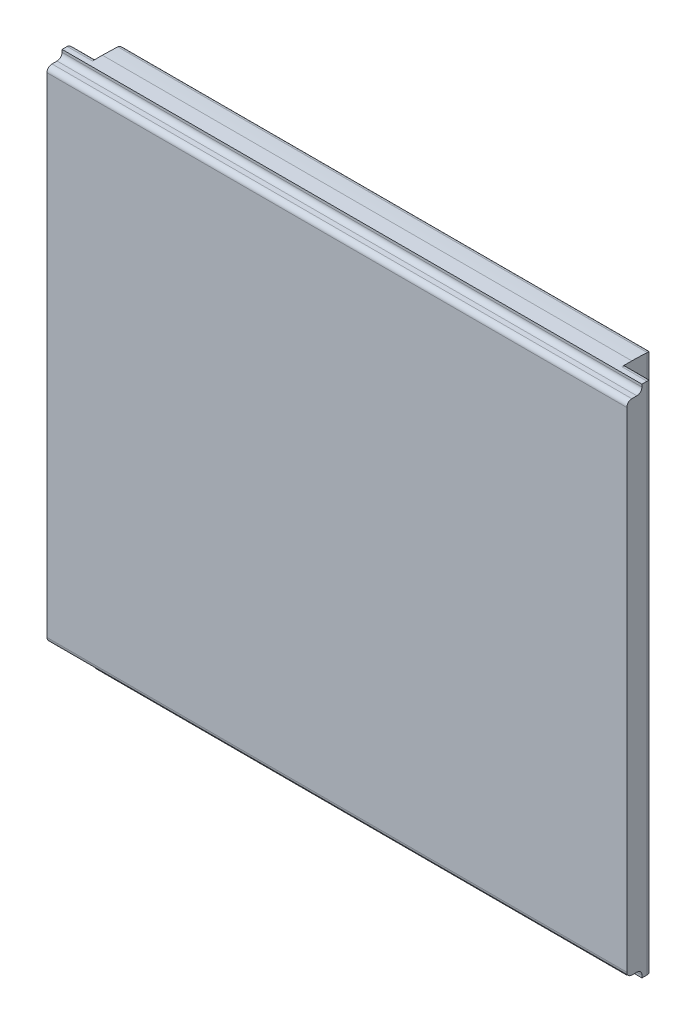
ISO-10303-21;
HEADER;
FILE_DESCRIPTION(('STEP AP214'),'2;1');
FILE_NAME('part.step','',(''),(''),'','','');
FILE_SCHEMA(('AUTOMOTIVE_DESIGN { 1 0 10303 214 1 1 1 1 }'));
ENDSEC;
DATA;
#1=APPLICATION_CONTEXT('core data for automotive mechanical design processes');
#2=APPLICATION_PROTOCOL_DEFINITION('international standard','automotive_design',2000,#1);
#3=PRODUCT_CONTEXT('',#1,'mechanical');
#4=PRODUCT('Part','Part','',(#3));
#5=PRODUCT_RELATED_PRODUCT_CATEGORY('part','',(#4));
#6=PRODUCT_DEFINITION_FORMATION('','',#4);
#7=PRODUCT_DEFINITION_CONTEXT('part definition',#1,'design');
#8=PRODUCT_DEFINITION('design','',#6,#7);
#9=PRODUCT_DEFINITION_SHAPE('','',#8);
#10=(LENGTH_UNIT() NAMED_UNIT(*) SI_UNIT(.MILLI.,.METRE.));
#11=(NAMED_UNIT(*) PLANE_ANGLE_UNIT() SI_UNIT($,.RADIAN.));
#12=(NAMED_UNIT(*) SI_UNIT($,.STERADIAN.) SOLID_ANGLE_UNIT());
#13=UNCERTAINTY_MEASURE_WITH_UNIT(LENGTH_MEASURE(1.E-05),#10,'distance_accuracy_value','');
#14=(GEOMETRIC_REPRESENTATION_CONTEXT(3) GLOBAL_UNCERTAINTY_ASSIGNED_CONTEXT((#13)) GLOBAL_UNIT_ASSIGNED_CONTEXT((#10,
#11,#12)) REPRESENTATION_CONTEXT('',''));
#15=CARTESIAN_POINT('',(0.,0.,0.));
#16=DIRECTION('',(0.,0.,1.));
#17=DIRECTION('',(1.,0.,0.));
#18=AXIS2_PLACEMENT_3D('',#15,#16,#17);
#19=CARTESIAN_POINT('',(52.5,-51.0099999999999,48.));
#20=DIRECTION('',(1.,0.,0.));
#21=DIRECTION('',(0.,0.,-1.));
#22=AXIS2_PLACEMENT_3D('',#19,#20,#21);
#23=PLANE('',#22);
#24=DIRECTION('',(0.,-0.707106781186544,0.707106781186551));
#25=VECTOR('',#24,1.);
#26=CARTESIAN_POINT('',(52.5,-53.2549999999999,45.755));
#27=LINE('',#26,#25);
#28=CARTESIAN_POINT('',(52.5,-51.4999999999999,44.));
#29=VERTEX_POINT('',#28);
#30=CARTESIAN_POINT('',(52.5,-53.8786796564403,46.3786796564404));
#31=VERTEX_POINT('',#30);
#32=EDGE_CURVE('E441',#29,#31,#27,.T.);
#33=ORIENTED_EDGE('',*,*,#32,.F.);
#34=DIRECTION('',(0.,-1.,0.));
#35=VECTOR('',#34,1.);
#36=CARTESIAN_POINT('',(52.5,-51.0099999999999,44.));
#37=LINE('',#36,#35);
#38=CARTESIAN_POINT('',(52.5,50.9117265087781,44.));
#39=VERTEX_POINT('',#38);
#40=EDGE_CURVE('E228',#29,#39,#37,.F.);
#41=ORIENTED_EDGE('',*,*,#40,.T.);
#42=CARTESIAN_POINT('',(52.5,-50.9999999999999,48.5));
#43=DIRECTION('',(1.,0.,0.));
#44=DIRECTION('',(0.,0.,-1.));
#45=AXIS2_PLACEMENT_3D('',#42,#43,#44);
#46=CIRCLE('',#45,102.011028815516);
#47=CARTESIAN_POINT('',(52.5,50.9999999999999,47.000000000001));
#48=VERTEX_POINT('',#47);
#49=EDGE_CURVE('E222',#39,#48,#46,.T.);
#50=ORIENTED_EDGE('',*,*,#49,.T.);
#51=DIRECTION('',(0.,0.,-1.));
#52=VECTOR('',#51,1.);
#53=CARTESIAN_POINT('',(52.5,50.9999999999999,0.));
#54=LINE('',#53,#52);
#55=CARTESIAN_POINT('',(52.5,50.9999999999999,49.));
#56=VERTEX_POINT('',#55);
#57=EDGE_CURVE('E225',#56,#48,#54,.T.);
#58=ORIENTED_EDGE('',*,*,#57,.F.);
#59=CARTESIAN_POINT('',(52.5,49.9999999999999,49.));
#60=DIRECTION('',(1.,0.,0.));
#61=DIRECTION('',(0.,0.,-1.));
#62=AXIS2_PLACEMENT_3D('',#59,#60,#61);
#63=CIRCLE('',#62,1.);
#64=CARTESIAN_POINT('',(52.5,49.9999999999999,48.));
#65=VERTEX_POINT('',#64);
#66=EDGE_CURVE('E50',#56,#65,#63,.F.);
#67=ORIENTED_EDGE('',*,*,#66,.T.);
#68=DIRECTION('',(0.,1.,0.));
#69=VECTOR('',#68,1.);
#70=CARTESIAN_POINT('',(52.5,-51.0099999999999,48.));
#71=LINE('',#70,#69);
#72=CARTESIAN_POINT('',(52.5,-50.9999999999999,48.));
#73=VERTEX_POINT('',#72);
#74=EDGE_CURVE('E296',#73,#65,#71,.T.);
#75=ORIENTED_EDGE('',*,*,#74,.F.);
#76=DIRECTION('',(0.,0.,-1.));
#77=VECTOR('',#76,1.);
#78=CARTESIAN_POINT('',(52.5,-50.9999999999999,48.));
#79=LINE('',#78,#77);
#80=CARTESIAN_POINT('',(52.5,-50.9999999999999,48.5));
#81=VERTEX_POINT('',#80);
#82=EDGE_CURVE('E583',#81,#73,#79,.T.);
#83=ORIENTED_EDGE('',*,*,#82,.F.);
#84=DIRECTION('',(0.,-1.,0.));
#85=VECTOR('',#84,1.);
#86=CARTESIAN_POINT('',(52.5,-51.0099999999999,48.5));
#87=LINE('',#86,#85);
#88=CARTESIAN_POINT('',(52.5,-52.9999999999999,48.5));
#89=VERTEX_POINT('',#88);
#90=EDGE_CURVE('E599',#81,#89,#87,.T.);
#91=ORIENTED_EDGE('',*,*,#90,.T.);
#92=CARTESIAN_POINT('',(52.5,-52.9999999999999,47.2573593128807));
#93=DIRECTION('',(1.,0.,0.));
#94=DIRECTION('',(0.,0.,-1.));
#95=AXIS2_PLACEMENT_3D('',#92,#93,#94);
#96=CIRCLE('',#95,1.24264068711927);
#97=EDGE_CURVE('E595',#89,#31,#96,.T.);
#98=ORIENTED_EDGE('',*,*,#97,.T.);
#99=EDGE_LOOP('',(#33,#41,#50,#58,#67,#75,#83,#91,#98));
#100=FACE_BOUND('',#99,.T.);
#101=ADVANCED_FACE('F40',(#100),#23,.T.);
#102=CARTESIAN_POINT('',(-52.5,-51.0099999999999,48.));
#103=DIRECTION('',(-1.,0.,0.));
#104=DIRECTION('',(0.,0.,1.));
#105=AXIS2_PLACEMENT_3D('',#102,#103,#104);
#106=PLANE('',#105);
#107=CARTESIAN_POINT('',(-52.5,-50.9999999999999,48.5));
#108=DIRECTION('',(-1.,0.,0.));
#109=DIRECTION('',(0.,0.,1.));
#110=AXIS2_PLACEMENT_3D('',#107,#108,#109);
#111=CIRCLE('',#110,102.011028815516);
#112=CARTESIAN_POINT('',(-52.5,50.9999999999999,47.000000000001));
#113=VERTEX_POINT('',#112);
#114=CARTESIAN_POINT('',(-52.5,50.9117265087781,44.));
#115=VERTEX_POINT('',#114);
#116=EDGE_CURVE('E233',#113,#115,#111,.T.);
#117=ORIENTED_EDGE('',*,*,#116,.T.);
#118=DIRECTION('',(0.,1.,0.));
#119=VECTOR('',#118,1.);
#120=CARTESIAN_POINT('',(-52.5,-51.0099999999999,44.));
#121=LINE('',#120,#119);
#122=CARTESIAN_POINT('',(-52.5,-51.4999999999999,44.));
#123=VERTEX_POINT('',#122);
#124=EDGE_CURVE('E66',#115,#123,#121,.F.);
#125=ORIENTED_EDGE('',*,*,#124,.T.);
#126=DIRECTION('',(0.,-0.707106781186544,0.707106781186551));
#127=VECTOR('',#126,1.);
#128=CARTESIAN_POINT('',(-52.5,-53.2549999999999,45.755));
#129=LINE('',#128,#127);
#130=CARTESIAN_POINT('',(-52.5,-53.8786796564403,46.3786796564404));
#131=VERTEX_POINT('',#130);
#132=EDGE_CURVE('E602',#123,#131,#129,.T.);
#133=ORIENTED_EDGE('',*,*,#132,.T.);
#134=CARTESIAN_POINT('',(-52.5,-52.9999999999999,47.2573593128807));
#135=DIRECTION('',(-1.,0.,0.));
#136=DIRECTION('',(0.,0.,1.));
#137=AXIS2_PLACEMENT_3D('',#134,#135,#136);
#138=CIRCLE('',#137,1.24264068711927);
#139=CARTESIAN_POINT('',(-52.5,-52.9999999999999,48.5));
#140=VERTEX_POINT('',#139);
#141=EDGE_CURVE('E449',#140,#131,#138,.F.);
#142=ORIENTED_EDGE('',*,*,#141,.F.);
#143=DIRECTION('',(0.,-1.,0.));
#144=VECTOR('',#143,1.);
#145=CARTESIAN_POINT('',(-52.5,-51.0099999999999,48.5));
#146=LINE('',#145,#144);
#147=CARTESIAN_POINT('',(-52.5,-50.9999999999999,48.5));
#148=VERTEX_POINT('',#147);
#149=EDGE_CURVE('E458',#148,#140,#146,.T.);
#150=ORIENTED_EDGE('',*,*,#149,.F.);
#151=DIRECTION('',(0.,0.,-1.));
#152=VECTOR('',#151,1.);
#153=CARTESIAN_POINT('',(-52.5,-50.9999999999999,48.));
#154=LINE('',#153,#152);
#155=CARTESIAN_POINT('',(-52.5,-50.9999999999999,48.));
#156=VERTEX_POINT('',#155);
#157=EDGE_CURVE('E232',#148,#156,#154,.T.);
#158=ORIENTED_EDGE('',*,*,#157,.T.);
#159=DIRECTION('',(0.,1.,0.));
#160=VECTOR('',#159,1.);
#161=CARTESIAN_POINT('',(-52.5,-51.0099999999999,48.));
#162=LINE('',#161,#160);
#163=CARTESIAN_POINT('',(-52.5,49.9999999999999,48.));
#164=VERTEX_POINT('',#163);
#165=EDGE_CURVE('E300',#156,#164,#162,.T.);
#166=ORIENTED_EDGE('',*,*,#165,.T.);
#167=CARTESIAN_POINT('',(-52.5,49.9999999999999,49.));
#168=DIRECTION('',(-1.,0.,0.));
#169=DIRECTION('',(0.,0.,1.));
#170=AXIS2_PLACEMENT_3D('',#167,#168,#169);
#171=CIRCLE('',#170,1.);
#172=CARTESIAN_POINT('',(-52.5,50.9999999999999,49.));
#173=VERTEX_POINT('',#172);
#174=EDGE_CURVE('E11',#164,#173,#171,.F.);
#175=ORIENTED_EDGE('',*,*,#174,.T.);
#176=DIRECTION('',(0.,0.,1.));
#177=VECTOR('',#176,1.);
#178=CARTESIAN_POINT('',(-52.5,50.9999999999999,0.));
#179=LINE('',#178,#177);
#180=EDGE_CURVE('E250',#113,#173,#179,.T.);
#181=ORIENTED_EDGE('',*,*,#180,.F.);
#182=EDGE_LOOP('',(#117,#125,#133,#142,#150,#158,#166,#175,#181));
#183=FACE_BOUND('',#182,.T.);
#184=ADVANCED_FACE('F610',(#183),#106,.T.);
#185=CARTESIAN_POINT('',(0.,50.9999999999999,0.));
#186=DIRECTION('',(0.,1.,0.));
#187=DIRECTION('',(0.,0.,1.));
#188=AXIS2_PLACEMENT_3D('',#185,#186,#187);
#189=PLANE('',#188);
#190=DIRECTION('',(0.,0.,-1.));
#191=VECTOR('',#190,1.);
#192=CARTESIAN_POINT('',(57.5,50.9999999999999,0.));
#193=LINE('',#192,#191);
#194=CARTESIAN_POINT('',(57.5,50.9999999999999,50.));
#195=VERTEX_POINT('',#194);
#196=CARTESIAN_POINT('',(57.5,50.9999999999999,49.));
#197=VERTEX_POINT('',#196);
#198=EDGE_CURVE('E251',#195,#197,#193,.T.);
#199=ORIENTED_EDGE('',*,*,#198,.T.);
#200=DIRECTION('',(-1.,0.,0.));
#201=VECTOR('',#200,1.);
#202=CARTESIAN_POINT('',(0.,50.9999999999999,49.));
#203=LINE('',#202,#201);
#204=EDGE_CURVE('E248',#197,#56,#203,.T.);
#205=ORIENTED_EDGE('',*,*,#204,.T.);
#206=ORIENTED_EDGE('',*,*,#57,.T.);
#207=DIRECTION('',(-1.,0.,0.));
#208=VECTOR('',#207,1.);
#209=CARTESIAN_POINT('',(57.5,50.9999999999999,47.000000000001));
#210=LINE('',#209,#208);
#211=EDGE_CURVE('E236',#48,#113,#210,.T.);
#212=ORIENTED_EDGE('',*,*,#211,.T.);
#213=ORIENTED_EDGE('',*,*,#180,.T.);
#214=DIRECTION('',(-1.,0.,0.));
#215=VECTOR('',#214,1.);
#216=CARTESIAN_POINT('',(0.,50.9999999999999,49.));
#217=LINE('',#216,#215);
#218=CARTESIAN_POINT('',(-57.5,50.9999999999999,49.));
#219=VERTEX_POINT('',#218);
#220=EDGE_CURVE('E326',#173,#219,#217,.T.);
#221=ORIENTED_EDGE('',*,*,#220,.T.);
#222=DIRECTION('',(0.,0.,1.));
#223=VECTOR('',#222,1.);
#224=CARTESIAN_POINT('',(-57.5,50.9999999999999,0.));
#225=LINE('',#224,#223);
#226=CARTESIAN_POINT('',(-57.5,50.9999999999999,50.));
#227=VERTEX_POINT('',#226);
#228=EDGE_CURVE('E255',#219,#227,#225,.T.);
#229=ORIENTED_EDGE('',*,*,#228,.T.);
#230=DIRECTION('',(-1.,0.,0.));
#231=VECTOR('',#230,1.);
#232=CARTESIAN_POINT('',(62.5,50.9999999999999,50.));
#233=LINE('',#232,#231);
#234=EDGE_CURVE('E301',#195,#227,#233,.T.);
#235=ORIENTED_EDGE('',*,*,#234,.F.);
#236=EDGE_LOOP('',(#199,#205,#206,#212,#213,#221,#229,#235));
#237=FACE_BOUND('',#236,.T.);
#238=ADVANCED_FACE('F246',(#237),#189,.T.);
#239=CARTESIAN_POINT('',(72.5,62.5,43.));
#240=DIRECTION('',(0.,0.,-1.));
#241=DIRECTION('',(-1.,0.,0.));
#242=AXIS2_PLACEMENT_3D('',#239,#240,#241);
#243=PLANE('',#242);
#244=DIRECTION('',(1.,0.,0.));
#245=VECTOR('',#244,1.);
#246=CARTESIAN_POINT('',(-52.5,-50.1339745962155,43.));
#247=LINE('',#246,#245);
#248=CARTESIAN_POINT('',(51.5,-50.1339745962155,43.));
#249=VERTEX_POINT('',#248);
#250=CARTESIAN_POINT('',(-51.5,-50.1339745962155,43.));
#251=VERTEX_POINT('',#250);
#252=EDGE_CURVE('E347',#249,#251,#247,.F.);
#253=ORIENTED_EDGE('',*,*,#252,.T.);
#254=DIRECTION('',(0.,1.,0.));
#255=VECTOR('',#254,1.);
#256=CARTESIAN_POINT('',(-51.5,62.5,43.));
#257=LINE('',#256,#255);
#258=CARTESIAN_POINT('',(-51.5,49.9107424527684,43.));
#259=VERTEX_POINT('',#258);
#260=EDGE_CURVE('E354',#251,#259,#257,.T.);
#261=ORIENTED_EDGE('',*,*,#260,.T.);
#262=DIRECTION('',(-1.,0.,0.));
#263=VECTOR('',#262,1.);
#264=CARTESIAN_POINT('',(72.5,49.9107424527684,43.));
#265=LINE('',#264,#263);
#266=CARTESIAN_POINT('',(51.5,49.9107424527684,43.));
#267=VERTEX_POINT('',#266);
#268=EDGE_CURVE('E350',#259,#267,#265,.F.);
#269=ORIENTED_EDGE('',*,*,#268,.T.);
#270=DIRECTION('',(0.,-1.,0.));
#271=VECTOR('',#270,1.);
#272=CARTESIAN_POINT('',(51.5,62.5,43.));
#273=LINE('',#272,#271);
#274=EDGE_CURVE('E344',#267,#249,#273,.T.);
#275=ORIENTED_EDGE('',*,*,#274,.T.);
#276=EDGE_LOOP('',(#253,#261,#269,#275));
#277=FACE_BOUND('',#276,.T.);
#278=CARTESIAN_POINT('',(-30.,47.4999999999999,43.));
#279=DIRECTION('',(0.,0.,-1.));
#280=DIRECTION('',(-1.,0.,0.));
#281=AXIS2_PLACEMENT_3D('',#278,#279,#280);
#282=CIRCLE('',#281,1.5);
#283=CARTESIAN_POINT('',(-31.5,47.4999999999999,43.));
#284=VERTEX_POINT('',#283);
#285=EDGE_CURVE('E310',#284,#284,#282,.F.);
#286=ORIENTED_EDGE('',*,*,#285,.T.);
#287=EDGE_LOOP('',(#286));
#288=FACE_BOUND('',#287,.T.);
#289=CARTESIAN_POINT('',(0.,38.5,43.));
#290=DIRECTION('',(0.,0.,-1.));
#291=DIRECTION('',(-1.,0.,0.));
#292=AXIS2_PLACEMENT_3D('',#289,#290,#291);
#293=CIRCLE('',#292,2.4);
#294=CARTESIAN_POINT('',(-2.40000000000001,38.5,43.));
#295=VERTEX_POINT('',#294);
#296=EDGE_CURVE('E306',#295,#295,#293,.F.);
#297=ORIENTED_EDGE('',*,*,#296,.T.);
#298=EDGE_LOOP('',(#297));
#299=FACE_BOUND('',#298,.T.);
#300=CARTESIAN_POINT('',(30.,47.4999999999999,43.));
#301=DIRECTION('',(0.,0.,-1.));
#302=DIRECTION('',(-1.,0.,0.));
#303=AXIS2_PLACEMENT_3D('',#300,#301,#302);
#304=CIRCLE('',#303,1.5);
#305=CARTESIAN_POINT('',(28.5,47.4999999999999,43.));
#306=VERTEX_POINT('',#305);
#307=EDGE_CURVE('E302',#306,#306,#304,.F.);
#308=ORIENTED_EDGE('',*,*,#307,.T.);
#309=EDGE_LOOP('',(#308));
#310=FACE_BOUND('',#309,.T.);
#311=ADVANCED_FACE('F676',(#277,#288,#299,#310),#243,.T.);
#312=CARTESIAN_POINT('',(0.,-50.9999999999999,0.));
#313=DIRECTION('',(0.,-1.,0.));
#314=DIRECTION('',(0.,0.,-1.));
#315=AXIS2_PLACEMENT_3D('',#312,#313,#314);
#316=PLANE('',#315);
#317=DIRECTION('',(0.,0.,-1.));
#318=VECTOR('',#317,1.);
#319=CARTESIAN_POINT('',(-57.5,-50.9999999999999,0.));
#320=LINE('',#319,#318);
#321=CARTESIAN_POINT('',(-57.5,-50.9999999999999,50.));
#322=VERTEX_POINT('',#321);
#323=CARTESIAN_POINT('',(-57.5,-50.9999999999999,49.));
#324=VERTEX_POINT('',#323);
#325=EDGE_CURVE('E273',#322,#324,#320,.T.);
#326=ORIENTED_EDGE('',*,*,#325,.T.);
#327=CARTESIAN_POINT('',(-56.5,-50.9999999999999,49.));
#328=DIRECTION('',(0.,-1.,0.));
#329=DIRECTION('',(0.,0.,-1.));
#330=AXIS2_PLACEMENT_3D('',#327,#328,#329);
#331=CIRCLE('',#330,1.);
#332=CARTESIAN_POINT('',(-56.5,-50.9999999999999,48.));
#333=VERTEX_POINT('',#332);
#334=EDGE_CURVE('E395',#324,#333,#331,.T.);
#335=ORIENTED_EDGE('',*,*,#334,.T.);
#336=DIRECTION('',(1.,0.,0.));
#337=VECTOR('',#336,1.);
#338=CARTESIAN_POINT('',(0.,-50.9999999999999,48.));
#339=LINE('',#338,#337);
#340=EDGE_CURVE('E268',#333,#156,#339,.T.);
#341=ORIENTED_EDGE('',*,*,#340,.T.);
#342=ORIENTED_EDGE('',*,*,#157,.F.);
#343=DIRECTION('',(1.,0.,0.));
#344=VECTOR('',#343,1.);
#345=CARTESIAN_POINT('',(-58.4594226755417,-50.9999999999999,48.5));
#346=LINE('',#345,#344);
#347=EDGE_CURVE('E446',#148,#81,#346,.T.);
#348=ORIENTED_EDGE('',*,*,#347,.T.);
#349=ORIENTED_EDGE('',*,*,#82,.T.);
#350=DIRECTION('',(1.,0.,0.));
#351=VECTOR('',#350,1.);
#352=CARTESIAN_POINT('',(0.,-50.9999999999999,48.));
#353=LINE('',#352,#351);
#354=CARTESIAN_POINT('',(56.5,-50.9999999999999,48.));
#355=VERTEX_POINT('',#354);
#356=EDGE_CURVE('E264',#73,#355,#353,.T.);
#357=ORIENTED_EDGE('',*,*,#356,.T.);
#358=CARTESIAN_POINT('',(56.5,-50.9999999999999,49.));
#359=DIRECTION('',(0.,-1.,0.));
#360=DIRECTION('',(0.,0.,-1.));
#361=AXIS2_PLACEMENT_3D('',#358,#359,#360);
#362=CIRCLE('',#361,1.);
#363=CARTESIAN_POINT('',(57.5,-50.9999999999999,49.));
#364=VERTEX_POINT('',#363);
#365=EDGE_CURVE('E392',#355,#364,#362,.T.);
#366=ORIENTED_EDGE('',*,*,#365,.T.);
#367=DIRECTION('',(0.,0.,1.));
#368=VECTOR('',#367,1.);
#369=CARTESIAN_POINT('',(57.5,-50.9999999999999,0.));
#370=LINE('',#369,#368);
#371=CARTESIAN_POINT('',(57.5,-50.9999999999999,50.));
#372=VERTEX_POINT('',#371);
#373=EDGE_CURVE('E261',#364,#372,#370,.T.);
#374=ORIENTED_EDGE('',*,*,#373,.T.);
#375=DIRECTION('',(1.,0.,0.));
#376=VECTOR('',#375,1.);
#377=CARTESIAN_POINT('',(62.5,-50.9999999999999,50.));
#378=LINE('',#377,#376);
#379=EDGE_CURVE('E500',#322,#372,#378,.T.);
#380=ORIENTED_EDGE('',*,*,#379,.F.);
#381=EDGE_LOOP('',(#326,#335,#341,#342,#348,#349,#357,#366,#374,#380));
#382=FACE_BOUND('',#381,.T.);
#383=ADVANCED_FACE('F582',(#382),#316,.T.);
#384=CARTESIAN_POINT('',(57.5,-51.0099999999999,48.));
#385=DIRECTION('',(1.,0.,0.));
#386=DIRECTION('',(0.,0.,-1.));
#387=AXIS2_PLACEMENT_3D('',#384,#385,#386);
#388=PLANE('',#387);
#389=ORIENTED_EDGE('',*,*,#373,.F.);
#390=DIRECTION('',(0.,1.,0.));
#391=VECTOR('',#390,1.);
#392=CARTESIAN_POINT('',(57.5,-51.0099999999999,49.));
#393=LINE('',#392,#391);
#394=EDGE_CURVE('E407',#364,#197,#393,.T.);
#395=ORIENTED_EDGE('',*,*,#394,.T.);
#396=ORIENTED_EDGE('',*,*,#198,.F.);
#397=DIRECTION('',(0.,1.,0.));
#398=VECTOR('',#397,1.);
#399=CARTESIAN_POINT('',(57.5,-130.113473882112,50.));
#400=LINE('',#399,#398);
#401=CARTESIAN_POINT('',(57.5,50.5,50.));
#402=VERTEX_POINT('',#401);
#403=EDGE_CURVE('E292',#402,#195,#400,.T.);
#404=ORIENTED_EDGE('',*,*,#403,.F.);
#405=CARTESIAN_POINT('',(57.5,50.5,51.));
#406=DIRECTION('',(1.,0.,0.));
#407=DIRECTION('',(0.,0.,-1.));
#408=AXIS2_PLACEMENT_3D('',#405,#406,#407);
#409=CIRCLE('',#408,1.);
#410=CARTESIAN_POINT('',(57.5,49.5,51.));
#411=VERTEX_POINT('',#410);
#412=EDGE_CURVE('E462',#402,#411,#409,.F.);
#413=ORIENTED_EDGE('',*,*,#412,.T.);
#414=DIRECTION('',(0.,0.,-1.));
#415=VECTOR('',#414,1.);
#416=CARTESIAN_POINT('',(57.5,49.5,0.));
#417=LINE('',#416,#415);
#418=CARTESIAN_POINT('',(57.5,49.5,52.));
#419=VERTEX_POINT('',#418);
#420=EDGE_CURVE('E287',#419,#411,#417,.T.);
#421=ORIENTED_EDGE('',*,*,#420,.F.);
#422=CARTESIAN_POINT('',(57.5,48.5,52.));
#423=DIRECTION('',(1.,0.,0.));
#424=DIRECTION('',(0.,0.,-1.));
#425=AXIS2_PLACEMENT_3D('',#422,#423,#424);
#426=CIRCLE('',#425,1.);
#427=CARTESIAN_POINT('',(57.5,48.5,53.));
#428=VERTEX_POINT('',#427);
#429=EDGE_CURVE('E282',#428,#419,#426,.F.);
#430=ORIENTED_EDGE('',*,*,#429,.F.);
#431=DIRECTION('',(0.,-1.,0.));
#432=VECTOR('',#431,1.);
#433=CARTESIAN_POINT('',(57.5,62.5,53.));
#434=LINE('',#433,#432);
#435=CARTESIAN_POINT('',(57.5,-48.5,53.));
#436=VERTEX_POINT('',#435);
#437=EDGE_CURVE('E257',#428,#436,#434,.T.);
#438=ORIENTED_EDGE('',*,*,#437,.T.);
#439=CARTESIAN_POINT('',(57.5,-48.5,52.));
#440=DIRECTION('',(1.,0.,0.));
#441=DIRECTION('',(0.,0.,-1.));
#442=AXIS2_PLACEMENT_3D('',#439,#440,#441);
#443=CIRCLE('',#442,1.);
#444=CARTESIAN_POINT('',(57.5,-49.5,52.));
#445=VERTEX_POINT('',#444);
#446=EDGE_CURVE('E269',#445,#436,#443,.F.);
#447=ORIENTED_EDGE('',*,*,#446,.F.);
#448=DIRECTION('',(0.,0.,1.));
#449=VECTOR('',#448,1.);
#450=CARTESIAN_POINT('',(57.5,-49.5,0.));
#451=LINE('',#450,#449);
#452=CARTESIAN_POINT('',(57.5,-49.5,51.));
#453=VERTEX_POINT('',#452);
#454=EDGE_CURVE('E274',#453,#445,#451,.T.);
#455=ORIENTED_EDGE('',*,*,#454,.F.);
#456=CARTESIAN_POINT('',(57.5,-50.5,51.));
#457=DIRECTION('',(1.,0.,0.));
#458=DIRECTION('',(0.,0.,-1.));
#459=AXIS2_PLACEMENT_3D('',#456,#457,#458);
#460=CIRCLE('',#459,1.);
#461=CARTESIAN_POINT('',(57.5,-50.5,50.));
#462=VERTEX_POINT('',#461);
#463=EDGE_CURVE('E467',#453,#462,#460,.F.);
#464=ORIENTED_EDGE('',*,*,#463,.T.);
#465=DIRECTION('',(0.,1.,0.));
#466=VECTOR('',#465,1.);
#467=CARTESIAN_POINT('',(57.5,130.113473882112,50.));
#468=LINE('',#467,#466);
#469=EDGE_CURVE('E278',#372,#462,#468,.T.);
#470=ORIENTED_EDGE('',*,*,#469,.F.);
#471=EDGE_LOOP('',(#389,#395,#396,#404,#413,#421,#430,#438,#447,#455,#464,#470));
#472=FACE_BOUND('',#471,.T.);
#473=ADVANCED_FACE('F545',(#472),#388,.T.);
#474=CARTESIAN_POINT('',(57.5,-51.0099999999999,48.));
#475=DIRECTION('',(0.,0.,-1.));
#476=DIRECTION('',(-1.,0.,0.));
#477=AXIS2_PLACEMENT_3D('',#474,#475,#476);
#478=PLANE('',#477);
#479=ORIENTED_EDGE('',*,*,#74,.T.);
#480=DIRECTION('',(-1.,0.,0.));
#481=VECTOR('',#480,1.);
#482=CARTESIAN_POINT('',(57.5,49.9999999999999,48.));
#483=LINE('',#482,#481);
#484=CARTESIAN_POINT('',(56.5,49.9999999999999,48.));
#485=VERTEX_POINT('',#484);
#486=EDGE_CURVE('E335',#65,#485,#483,.F.);
#487=ORIENTED_EDGE('',*,*,#486,.T.);
#488=DIRECTION('',(0.,1.,0.));
#489=VECTOR('',#488,1.);
#490=CARTESIAN_POINT('',(56.5,-51.0099999999999,48.));
#491=LINE('',#490,#489);
#492=EDGE_CURVE('E332',#485,#355,#491,.F.);
#493=ORIENTED_EDGE('',*,*,#492,.T.);
#494=ORIENTED_EDGE('',*,*,#356,.F.);
#495=EDGE_LOOP('',(#479,#487,#493,#494));
#496=FACE_BOUND('',#495,.T.);
#497=ADVANCED_FACE('F581',(#496),#478,.T.);
#498=CARTESIAN_POINT('',(-57.5,-51.0099999999999,48.));
#499=DIRECTION('',(-1.,0.,0.));
#500=DIRECTION('',(0.,0.,1.));
#501=AXIS2_PLACEMENT_3D('',#498,#499,#500);
#502=PLANE('',#501);
#503=ORIENTED_EDGE('',*,*,#228,.F.);
#504=DIRECTION('',(0.,1.,0.));
#505=VECTOR('',#504,1.);
#506=CARTESIAN_POINT('',(-57.5,-51.0099999999999,49.));
#507=LINE('',#506,#505);
#508=EDGE_CURVE('E389',#219,#324,#507,.F.);
#509=ORIENTED_EDGE('',*,*,#508,.T.);
#510=ORIENTED_EDGE('',*,*,#325,.F.);
#511=DIRECTION('',(0.,-1.,0.));
#512=VECTOR('',#511,1.);
#513=CARTESIAN_POINT('',(-57.5,130.113473882112,50.));
#514=LINE('',#513,#512);
#515=CARTESIAN_POINT('',(-57.5,-50.5,50.));
#516=VERTEX_POINT('',#515);
#517=EDGE_CURVE('E281',#516,#322,#514,.T.);
#518=ORIENTED_EDGE('',*,*,#517,.F.);
#519=CARTESIAN_POINT('',(-57.5,-50.5,51.));
#520=DIRECTION('',(-1.,0.,0.));
#521=DIRECTION('',(0.,0.,1.));
#522=AXIS2_PLACEMENT_3D('',#519,#520,#521);
#523=CIRCLE('',#522,1.);
#524=CARTESIAN_POINT('',(-57.5,-49.5,51.));
#525=VERTEX_POINT('',#524);
#526=EDGE_CURVE('E463',#516,#525,#523,.F.);
#527=ORIENTED_EDGE('',*,*,#526,.T.);
#528=DIRECTION('',(0.,0.,-1.));
#529=VECTOR('',#528,1.);
#530=CARTESIAN_POINT('',(-57.5,-49.5,0.));
#531=LINE('',#530,#529);
#532=CARTESIAN_POINT('',(-57.5,-49.5,52.));
#533=VERTEX_POINT('',#532);
#534=EDGE_CURVE('E277',#533,#525,#531,.T.);
#535=ORIENTED_EDGE('',*,*,#534,.F.);
#536=CARTESIAN_POINT('',(-57.5,-48.5,52.));
#537=DIRECTION('',(-1.,0.,0.));
#538=DIRECTION('',(0.,0.,1.));
#539=AXIS2_PLACEMENT_3D('',#536,#537,#538);
#540=CIRCLE('',#539,1.);
#541=CARTESIAN_POINT('',(-57.5,-48.5,53.));
#542=VERTEX_POINT('',#541);
#543=EDGE_CURVE('E272',#542,#533,#540,.F.);
#544=ORIENTED_EDGE('',*,*,#543,.F.);
#545=DIRECTION('',(0.,1.,0.));
#546=VECTOR('',#545,1.);
#547=CARTESIAN_POINT('',(-57.5,62.5,53.));
#548=LINE('',#547,#546);
#549=CARTESIAN_POINT('',(-57.5,48.5,53.));
#550=VERTEX_POINT('',#549);
#551=EDGE_CURVE('E468',#542,#550,#548,.T.);
#552=ORIENTED_EDGE('',*,*,#551,.T.);
#553=CARTESIAN_POINT('',(-57.5,48.5,52.));
#554=DIRECTION('',(-1.,0.,0.));
#555=DIRECTION('',(0.,0.,1.));
#556=AXIS2_PLACEMENT_3D('',#553,#554,#555);
#557=CIRCLE('',#556,1.);
#558=CARTESIAN_POINT('',(-57.5,49.5,52.));
#559=VERTEX_POINT('',#558);
#560=EDGE_CURVE('E286',#559,#550,#557,.F.);
#561=ORIENTED_EDGE('',*,*,#560,.F.);
#562=DIRECTION('',(0.,0.,1.));
#563=VECTOR('',#562,1.);
#564=CARTESIAN_POINT('',(-57.5,49.5,0.));
#565=LINE('',#564,#563);
#566=CARTESIAN_POINT('',(-57.5,49.5,51.));
#567=VERTEX_POINT('',#566);
#568=EDGE_CURVE('E291',#567,#559,#565,.T.);
#569=ORIENTED_EDGE('',*,*,#568,.F.);
#570=CARTESIAN_POINT('',(-57.5,50.5,51.));
#571=DIRECTION('',(-1.,0.,0.));
#572=DIRECTION('',(0.,0.,1.));
#573=AXIS2_PLACEMENT_3D('',#570,#571,#572);
#574=CIRCLE('',#573,1.);
#575=CARTESIAN_POINT('',(-57.5,50.5,50.));
#576=VERTEX_POINT('',#575);
#577=EDGE_CURVE('E457',#567,#576,#574,.F.);
#578=ORIENTED_EDGE('',*,*,#577,.T.);
#579=DIRECTION('',(0.,-1.,0.));
#580=VECTOR('',#579,1.);
#581=CARTESIAN_POINT('',(-57.5,-130.113473882112,50.));
#582=LINE('',#581,#580);
#583=EDGE_CURVE('E295',#227,#576,#582,.T.);
#584=ORIENTED_EDGE('',*,*,#583,.F.);
#585=EDGE_LOOP('',(#503,#509,#510,#518,#527,#535,#544,#552,#561,#569,#578,#584));
#586=FACE_BOUND('',#585,.T.);
#587=ADVANCED_FACE('F638',(#586),#502,.T.);
#588=CARTESIAN_POINT('',(-57.5,-51.0099999999999,48.));
#589=DIRECTION('',(0.,0.,-1.));
#590=DIRECTION('',(-1.,0.,0.));
#591=AXIS2_PLACEMENT_3D('',#588,#589,#590);
#592=PLANE('',#591);
#593=DIRECTION('',(0.,1.,0.));
#594=VECTOR('',#593,1.);
#595=CARTESIAN_POINT('',(-56.5,-51.0099999999999,48.));
#596=LINE('',#595,#594);
#597=CARTESIAN_POINT('',(-56.5,49.9999999999999,48.));
#598=VERTEX_POINT('',#597);
#599=EDGE_CURVE('E338',#333,#598,#596,.T.);
#600=ORIENTED_EDGE('',*,*,#599,.T.);
#601=DIRECTION('',(-1.,0.,0.));
#602=VECTOR('',#601,1.);
#603=CARTESIAN_POINT('',(-57.5,49.9999999999999,48.));
#604=LINE('',#603,#602);
#605=EDGE_CURVE('E341',#598,#164,#604,.F.);
#606=ORIENTED_EDGE('',*,*,#605,.T.);
#607=ORIENTED_EDGE('',*,*,#165,.F.);
#608=ORIENTED_EDGE('',*,*,#340,.F.);
#609=EDGE_LOOP('',(#600,#606,#607,#608));
#610=FACE_BOUND('',#609,.T.);
#611=ADVANCED_FACE('F625',(#610),#592,.T.);
#612=CARTESIAN_POINT('',(72.5,62.5,53.));
#613=DIRECTION('',(0.,0.,-1.));
#614=DIRECTION('',(-1.,0.,0.));
#615=AXIS2_PLACEMENT_3D('',#612,#613,#614);
#616=PLANE('',#615);
#617=ORIENTED_EDGE('',*,*,#437,.F.);
#618=DIRECTION('',(-1.,0.,0.));
#619=VECTOR('',#618,1.);
#620=CARTESIAN_POINT('',(-62.5,48.5,53.));
#621=LINE('',#620,#619);
#622=EDGE_CURVE('E504',#428,#550,#621,.T.);
#623=ORIENTED_EDGE('',*,*,#622,.T.);
#624=ORIENTED_EDGE('',*,*,#551,.F.);
#625=DIRECTION('',(-1.,0.,0.));
#626=VECTOR('',#625,1.);
#627=CARTESIAN_POINT('',(-62.5,-48.5,53.));
#628=LINE('',#627,#626);
#629=EDGE_CURVE('E519',#436,#542,#628,.T.);
#630=ORIENTED_EDGE('',*,*,#629,.F.);
#631=EDGE_LOOP('',(#617,#623,#624,#630));
#632=FACE_BOUND('',#631,.T.);
#633=ADVANCED_FACE('F550',(#632),#616,.F.);
#634=CARTESIAN_POINT('',(72.5,-48.5,52.));
#635=DIRECTION('',(1.,0.,0.));
#636=DIRECTION('',(0.,0.,-1.));
#637=AXIS2_PLACEMENT_3D('',#634,#635,#636);
#638=CYLINDRICAL_SURFACE('',#637,1.);
#639=DIRECTION('',(-1.,0.,0.));
#640=VECTOR('',#639,1.);
#641=CARTESIAN_POINT('',(62.5,-49.5,52.));
#642=LINE('',#641,#640);
#643=EDGE_CURVE('E493',#533,#445,#642,.F.);
#644=ORIENTED_EDGE('',*,*,#643,.T.);
#645=ORIENTED_EDGE('',*,*,#446,.T.);
#646=ORIENTED_EDGE('',*,*,#629,.T.);
#647=ORIENTED_EDGE('',*,*,#543,.T.);
#648=EDGE_LOOP('',(#644,#645,#646,#647));
#649=FACE_BOUND('',#648,.T.);
#650=ADVANCED_FACE('F552',(#649),#638,.T.);
#651=CARTESIAN_POINT('',(0.,-49.5,0.));
#652=DIRECTION('',(0.,-1.,0.));
#653=DIRECTION('',(0.,0.,1.));
#654=AXIS2_PLACEMENT_3D('',#651,#652,#653);
#655=PLANE('',#654);
#656=DIRECTION('',(-1.,0.,0.));
#657=VECTOR('',#656,1.);
#658=CARTESIAN_POINT('',(-62.5,-49.5,51.));
#659=LINE('',#658,#657);
#660=EDGE_CURVE('E527',#453,#525,#659,.T.);
#661=ORIENTED_EDGE('',*,*,#660,.F.);
#662=ORIENTED_EDGE('',*,*,#454,.T.);
#663=ORIENTED_EDGE('',*,*,#643,.F.);
#664=ORIENTED_EDGE('',*,*,#534,.T.);
#665=EDGE_LOOP('',(#661,#662,#663,#664));
#666=FACE_BOUND('',#665,.T.);
#667=ADVANCED_FACE('F555',(#666),#655,.T.);
#668=CARTESIAN_POINT('',(0.,-50.5,51.));
#669=DIRECTION('',(1.,0.,0.));
#670=DIRECTION('',(0.,0.,-1.));
#671=AXIS2_PLACEMENT_3D('',#668,#669,#670);
#672=CYLINDRICAL_SURFACE('',#671,1.);
#673=ORIENTED_EDGE('',*,*,#463,.F.);
#674=ORIENTED_EDGE('',*,*,#660,.T.);
#675=ORIENTED_EDGE('',*,*,#526,.F.);
#676=DIRECTION('',(-1.,0.,0.));
#677=VECTOR('',#676,1.);
#678=CARTESIAN_POINT('',(62.5,-50.5,50.));
#679=LINE('',#678,#677);
#680=EDGE_CURVE('E523',#516,#462,#679,.F.);
#681=ORIENTED_EDGE('',*,*,#680,.T.);
#682=EDGE_LOOP('',(#673,#674,#675,#681));
#683=FACE_BOUND('',#682,.T.);
#684=ADVANCED_FACE('F559',(#683),#672,.F.);
#685=CARTESIAN_POINT('',(62.5,130.113473882112,50.));
#686=DIRECTION('',(0.,0.,1.));
#687=DIRECTION('',(1.,0.,0.));
#688=AXIS2_PLACEMENT_3D('',#685,#686,#687);
#689=PLANE('',#688);
#690=ORIENTED_EDGE('',*,*,#379,.T.);
#691=ORIENTED_EDGE('',*,*,#469,.T.);
#692=ORIENTED_EDGE('',*,*,#680,.F.);
#693=ORIENTED_EDGE('',*,*,#517,.T.);
#694=EDGE_LOOP('',(#690,#691,#692,#693));
#695=FACE_BOUND('',#694,.T.);
#696=ADVANCED_FACE('F563',(#695),#689,.T.);
#697=CARTESIAN_POINT('',(72.5,48.5,52.));
#698=DIRECTION('',(1.,0.,0.));
#699=DIRECTION('',(0.,0.,-1.));
#700=AXIS2_PLACEMENT_3D('',#697,#698,#699);
#701=CYLINDRICAL_SURFACE('',#700,1.);
#702=ORIENTED_EDGE('',*,*,#622,.F.);
#703=ORIENTED_EDGE('',*,*,#429,.T.);
#704=DIRECTION('',(-1.,0.,0.));
#705=VECTOR('',#704,1.);
#706=CARTESIAN_POINT('',(62.5,49.5,52.));
#707=LINE('',#706,#705);
#708=EDGE_CURVE('E515',#559,#419,#707,.F.);
#709=ORIENTED_EDGE('',*,*,#708,.F.);
#710=ORIENTED_EDGE('',*,*,#560,.T.);
#711=EDGE_LOOP('',(#702,#703,#709,#710));
#712=FACE_BOUND('',#711,.T.);
#713=ADVANCED_FACE('F651',(#712),#701,.T.);
#714=CARTESIAN_POINT('',(0.,49.5,0.));
#715=DIRECTION('',(0.,1.,0.));
#716=DIRECTION('',(0.,0.,1.));
#717=AXIS2_PLACEMENT_3D('',#714,#715,#716);
#718=PLANE('',#717);
#719=ORIENTED_EDGE('',*,*,#708,.T.);
#720=ORIENTED_EDGE('',*,*,#420,.T.);
#721=DIRECTION('',(-1.,0.,0.));
#722=VECTOR('',#721,1.);
#723=CARTESIAN_POINT('',(-62.5,49.5,51.));
#724=LINE('',#723,#722);
#725=EDGE_CURVE('E512',#411,#567,#724,.T.);
#726=ORIENTED_EDGE('',*,*,#725,.T.);
#727=ORIENTED_EDGE('',*,*,#568,.T.);
#728=EDGE_LOOP('',(#719,#720,#726,#727));
#729=FACE_BOUND('',#728,.T.);
#730=ADVANCED_FACE('F648',(#729),#718,.T.);
#731=CARTESIAN_POINT('',(0.,50.5,51.));
#732=DIRECTION('',(1.,0.,0.));
#733=DIRECTION('',(0.,0.,-1.));
#734=AXIS2_PLACEMENT_3D('',#731,#732,#733);
#735=CYLINDRICAL_SURFACE('',#734,1.);
#736=ORIENTED_EDGE('',*,*,#412,.F.);
#737=DIRECTION('',(-1.,0.,0.));
#738=VECTOR('',#737,1.);
#739=CARTESIAN_POINT('',(62.5,50.5,50.));
#740=LINE('',#739,#738);
#741=EDGE_CURVE('E508',#576,#402,#740,.F.);
#742=ORIENTED_EDGE('',*,*,#741,.F.);
#743=ORIENTED_EDGE('',*,*,#577,.F.);
#744=ORIENTED_EDGE('',*,*,#725,.F.);
#745=EDGE_LOOP('',(#736,#742,#743,#744));
#746=FACE_BOUND('',#745,.T.);
#747=ADVANCED_FACE('F646',(#746),#735,.F.);
#748=CARTESIAN_POINT('',(62.5,-130.113473882112,50.));
#749=DIRECTION('',(0.,0.,1.));
#750=DIRECTION('',(1.,0.,0.));
#751=AXIS2_PLACEMENT_3D('',#748,#749,#750);
#752=PLANE('',#751);
#753=ORIENTED_EDGE('',*,*,#741,.T.);
#754=ORIENTED_EDGE('',*,*,#403,.T.);
#755=ORIENTED_EDGE('',*,*,#234,.T.);
#756=ORIENTED_EDGE('',*,*,#583,.T.);
#757=EDGE_LOOP('',(#753,#754,#755,#756));
#758=FACE_BOUND('',#757,.T.);
#759=ADVANCED_FACE('F643',(#758),#752,.T.);
#760=CARTESIAN_POINT('',(-58.4594226755417,-52.9999999999999,47.2573593128807));
#761=DIRECTION('',(1.,0.,0.));
#762=DIRECTION('',(0.,0.,-1.));
#763=AXIS2_PLACEMENT_3D('',#760,#761,#762);
#764=CYLINDRICAL_SURFACE('',#763,1.24264068711927);
#765=DIRECTION('',(1.,0.,0.));
#766=VECTOR('',#765,1.);
#767=CARTESIAN_POINT('',(-58.4594226755417,-52.9999999999999,48.5));
#768=LINE('',#767,#766);
#769=EDGE_CURVE('E454',#140,#89,#768,.T.);
#770=ORIENTED_EDGE('',*,*,#769,.F.);
#771=ORIENTED_EDGE('',*,*,#141,.T.);
#772=DIRECTION('',(1.,0.,0.));
#773=VECTOR('',#772,1.);
#774=CARTESIAN_POINT('',(-58.4594226755417,-53.8786796564403,46.3786796564404));
#775=LINE('',#774,#773);
#776=EDGE_CURVE('E442',#131,#31,#775,.T.);
#777=ORIENTED_EDGE('',*,*,#776,.T.);
#778=ORIENTED_EDGE('',*,*,#97,.F.);
#779=EDGE_LOOP('',(#770,#771,#777,#778));
#780=FACE_BOUND('',#779,.T.);
#781=ADVANCED_FACE('F616',(#780),#764,.T.);
#782=CARTESIAN_POINT('',(-58.4594226755417,-53.2549999999999,45.755));
#783=DIRECTION('',(0.,0.707106781186551,0.707106781186544));
#784=DIRECTION('',(0.,-0.707106781186544,0.707106781186551));
#785=AXIS2_PLACEMENT_3D('',#782,#783,#784);
#786=PLANE('',#785);
#787=ORIENTED_EDGE('',*,*,#132,.F.);
#788=CARTESIAN_POINT('',(-51.5,-51.4999999999999,44.));
#789=DIRECTION('',(0.,0.707106781186551,0.707106781186544));
#790=DIRECTION('',(0.,0.707106781186544,-0.707106781186551));
#791=AXIS2_PLACEMENT_3D('',#788,#789,#790);
#792=ELLIPSE('',#791,1.41421356237309,1.);
#793=CARTESIAN_POINT('',(-52.3660254037844,-50.9999999999999,43.5));
#794=VERTEX_POINT('',#793);
#795=EDGE_CURVE('E402',#123,#794,#792,.F.);
#796=ORIENTED_EDGE('',*,*,#795,.T.);
#797=DIRECTION('',(1.,0.,0.));
#798=VECTOR('',#797,1.);
#799=CARTESIAN_POINT('',(-58.4594226755417,-50.9999999999999,43.5));
#800=LINE('',#799,#798);
#801=CARTESIAN_POINT('',(52.3660254037844,-50.9999999999999,43.5));
#802=VERTEX_POINT('',#801);
#803=EDGE_CURVE('E439',#794,#802,#800,.T.);
#804=ORIENTED_EDGE('',*,*,#803,.T.);
#805=CARTESIAN_POINT('',(51.5,-51.4999999999999,44.));
#806=DIRECTION('',(0.,0.707106781186551,0.707106781186544));
#807=DIRECTION('',(0.,-0.707106781186544,0.707106781186551));
#808=AXIS2_PLACEMENT_3D('',#805,#806,#807);
#809=ELLIPSE('',#808,1.41421356237309,1.);
#810=EDGE_CURVE('E58',#802,#29,#809,.F.);
#811=ORIENTED_EDGE('',*,*,#810,.T.);
#812=ORIENTED_EDGE('',*,*,#32,.T.);
#813=ORIENTED_EDGE('',*,*,#776,.F.);
#814=EDGE_LOOP('',(#787,#796,#804,#811,#812,#813));
#815=FACE_BOUND('',#814,.T.);
#816=ADVANCED_FACE('F612',(#815),#786,.F.);
#817=CARTESIAN_POINT('',(-58.4594226755417,-51.0099999999999,48.5));
#818=DIRECTION('',(0.,0.,1.));
#819=DIRECTION('',(1.,0.,0.));
#820=AXIS2_PLACEMENT_3D('',#817,#818,#819);
#821=PLANE('',#820);
#822=ORIENTED_EDGE('',*,*,#347,.F.);
#823=ORIENTED_EDGE('',*,*,#149,.T.);
#824=ORIENTED_EDGE('',*,*,#769,.T.);
#825=ORIENTED_EDGE('',*,*,#90,.F.);
#826=EDGE_LOOP('',(#822,#823,#824,#825));
#827=FACE_BOUND('',#826,.T.);
#828=ADVANCED_FACE('F618',(#827),#821,.T.);
#829=CARTESIAN_POINT('',(57.5,-50.9999999999999,48.5));
#830=DIRECTION('',(-1.,0.,0.));
#831=DIRECTION('',(0.,0.,1.));
#832=AXIS2_PLACEMENT_3D('',#829,#830,#831);
#833=CYLINDRICAL_SURFACE('',#832,102.011028815516);
#834=DIRECTION('',(-1.,0.,0.));
#835=VECTOR('',#834,1.);
#836=CARTESIAN_POINT('',(57.5,50.9097496268966,43.9554504092002));
#837=LINE('',#836,#835);
#838=CARTESIAN_POINT('',(52.4990071741282,50.9097496268966,43.9554504092002));
#839=VERTEX_POINT('',#838);
#840=CARTESIAN_POINT('',(-52.4990071741282,50.9097496268966,43.9554504092002));
#841=VERTEX_POINT('',#840);
#842=EDGE_CURVE('E366',#839,#841,#837,.T.);
#843=ORIENTED_EDGE('',*,*,#842,.T.);
#844=CARTESIAN_POINT('',(-52.4990071741282,50.9097496268966,43.9554504092002));
#845=CARTESIAN_POINT('',(-52.4993380941021,50.9100805667933,43.9628715890585));
#846=CARTESIAN_POINT('',(-52.4995862895784,50.9104107768985,43.9702946448876));
#847=CARTESIAN_POINT('',(-52.4999172315357,50.9110697375256,43.9851445084875));
#848=CARTESIAN_POINT('',(-52.4999999780167,50.9113984880476,43.9925713162583));
#849=CARTESIAN_POINT('',(-52.5,50.9117265087781,44.));
#850=B_SPLINE_CURVE_WITH_KNOTS('',3,(#844,#845,#846,#847,#848,#849),.UNSPECIFIED.,.F.,.F.,(4,2,
4),(0.,0.022303622529838,0.0446072450596756),.UNSPECIFIED.);
#851=EDGE_CURVE('E382',#841,#115,#850,.T.);
#852=ORIENTED_EDGE('',*,*,#851,.T.);
#853=ORIENTED_EDGE('',*,*,#116,.F.);
#854=ORIENTED_EDGE('',*,*,#211,.F.);
#855=ORIENTED_EDGE('',*,*,#49,.F.);
#856=CARTESIAN_POINT('',(52.5,50.9117265087781,44.));
#857=CARTESIAN_POINT('',(52.4999999780167,50.9113984880476,43.9925713162583));
#858=CARTESIAN_POINT('',(52.4999172315357,50.9110697375256,43.9851445084875));
#859=CARTESIAN_POINT('',(52.4995862895785,50.9104107768985,43.9702946448876));
#860=CARTESIAN_POINT('',(52.4993380941021,50.9100805667933,43.9628715890585));
#861=CARTESIAN_POINT('',(52.4990071741282,50.9097496268966,43.9554504092002));
#862=B_SPLINE_CURVE_WITH_KNOTS('',3,(#856,#857,#858,#859,#860,#861),.UNSPECIFIED.,.F.,.F.,(4,2,
4),(0.,0.022303622529836,0.0446072450596741),.UNSPECIFIED.);
#863=EDGE_CURVE('E357',#39,#839,#862,.T.);
#864=ORIENTED_EDGE('',*,*,#863,.T.);
#865=EDGE_LOOP('',(#843,#852,#853,#854,#855,#864));
#866=FACE_BOUND('',#865,.T.);
#867=ADVANCED_FACE('F238',(#866),#833,.T.);
#868=CARTESIAN_POINT('',(0.,38.5,48.));
#869=DIRECTION('',(0.,0.,1.));
#870=DIRECTION('',(1.,0.,0.));
#871=AXIS2_PLACEMENT_3D('',#868,#869,#870);
#872=PLANE('',#871);
#873=CARTESIAN_POINT('',(0.,38.5,48.));
#874=DIRECTION('',(0.,0.,-1.));
#875=DIRECTION('',(-1.,0.,0.));
#876=AXIS2_PLACEMENT_3D('',#873,#874,#875);
#877=CIRCLE('',#876,1.9);
#878=CARTESIAN_POINT('',(-1.90000000000001,38.5,48.));
#879=VERTEX_POINT('',#878);
#880=EDGE_CURVE('E242',#879,#879,#877,.T.);
#881=ORIENTED_EDGE('',*,*,#880,.T.);
#882=EDGE_LOOP('',(#881));
#883=FACE_BOUND('',#882,.T.);
#884=ADVANCED_FACE('F820',(#883),#872,.F.);
#885=CARTESIAN_POINT('',(0.,38.5,43.));
#886=DIRECTION('',(0.,0.,-1.));
#887=DIRECTION('',(-1.,0.,0.));
#888=AXIS2_PLACEMENT_3D('',#885,#886,#887);
#889=CYLINDRICAL_SURFACE('',#888,1.9);
#890=CARTESIAN_POINT('',(0.,38.5,43.5));
#891=DIRECTION('',(0.,0.,-1.));
#892=DIRECTION('',(-1.,0.,0.));
#893=AXIS2_PLACEMENT_3D('',#890,#891,#892);
#894=CIRCLE('',#893,1.9);
#895=CARTESIAN_POINT('',(-1.90000000000001,38.5,43.5));
#896=VERTEX_POINT('',#895);
#897=EDGE_CURVE('E318',#896,#896,#894,.T.);
#898=ORIENTED_EDGE('',*,*,#897,.T.);
#899=EDGE_LOOP('',(#898));
#900=FACE_BOUND('',#899,.T.);
#901=ORIENTED_EDGE('',*,*,#880,.F.);
#902=EDGE_LOOP('',(#901));
#903=FACE_BOUND('',#902,.T.);
#904=ADVANCED_FACE('F812',(#900,#903),#889,.F.);
#905=CARTESIAN_POINT('',(30.,47.4999999999999,45.5));
#906=DIRECTION('',(0.,0.,-1.));
#907=DIRECTION('',(-1.,0.,0.));
#908=AXIS2_PLACEMENT_3D('',#905,#906,#907);
#909=CYLINDRICAL_SURFACE('',#908,1.);
#910=CARTESIAN_POINT('',(30.,47.4999999999999,43.5));
#911=DIRECTION('',(0.,0.,-1.));
#912=DIRECTION('',(-1.,0.,0.));
#913=AXIS2_PLACEMENT_3D('',#910,#911,#912);
#914=CIRCLE('',#913,1.);
#915=CARTESIAN_POINT('',(29.,47.4999999999999,43.5));
#916=VERTEX_POINT('',#915);
#917=EDGE_CURVE('E322',#916,#916,#914,.T.);
#918=ORIENTED_EDGE('',*,*,#917,.T.);
#919=EDGE_LOOP('',(#918));
#920=FACE_BOUND('',#919,.T.);
#921=CARTESIAN_POINT('',(30.,47.4999999999999,45.5));
#922=DIRECTION('',(0.,0.,-1.));
#923=DIRECTION('',(-1.,0.,0.));
#924=AXIS2_PLACEMENT_3D('',#921,#922,#923);
#925=CIRCLE('',#924,1.);
#926=CARTESIAN_POINT('',(29.,47.4999999999999,45.5));
#927=VERTEX_POINT('',#926);
#928=EDGE_CURVE('E983',#927,#927,#925,.T.);
#929=ORIENTED_EDGE('',*,*,#928,.F.);
#930=EDGE_LOOP('',(#929));
#931=FACE_BOUND('',#930,.T.);
#932=ADVANCED_FACE('F803',(#920,#931),#909,.F.);
#933=CARTESIAN_POINT('',(30.,47.4999999999999,45.5));
#934=DIRECTION('',(0.,0.,-1.));
#935=DIRECTION('',(-1.,0.,0.));
#936=AXIS2_PLACEMENT_3D('',#933,#934,#935);
#937=PLANE('',#936);
#938=ORIENTED_EDGE('',*,*,#928,.T.);
#939=EDGE_LOOP('',(#938));
#940=FACE_BOUND('',#939,.T.);
#941=ADVANCED_FACE('F794',(#940),#937,.T.);
#942=CARTESIAN_POINT('',(-30.,47.4999999999999,45.5));
#943=DIRECTION('',(0.,0.,-1.));
#944=DIRECTION('',(-1.,0.,0.));
#945=AXIS2_PLACEMENT_3D('',#942,#943,#944);
#946=CYLINDRICAL_SURFACE('',#945,1.);
#947=CARTESIAN_POINT('',(-30.,47.4999999999999,43.5));
#948=DIRECTION('',(0.,0.,-1.));
#949=DIRECTION('',(-1.,0.,0.));
#950=AXIS2_PLACEMENT_3D('',#947,#948,#949);
#951=CIRCLE('',#950,1.);
#952=CARTESIAN_POINT('',(-31.,47.4999999999999,43.5));
#953=VERTEX_POINT('',#952);
#954=EDGE_CURVE('E314',#953,#953,#951,.T.);
#955=ORIENTED_EDGE('',*,*,#954,.T.);
#956=EDGE_LOOP('',(#955));
#957=FACE_BOUND('',#956,.T.);
#958=CARTESIAN_POINT('',(-30.,47.4999999999999,45.5));
#959=DIRECTION('',(0.,0.,1.));
#960=DIRECTION('',(1.,0.,0.));
#961=AXIS2_PLACEMENT_3D('',#958,#959,#960);
#962=CIRCLE('',#961,1.);
#963=CARTESIAN_POINT('',(-29.,47.4999999999999,45.5));
#964=VERTEX_POINT('',#963);
#965=EDGE_CURVE('E416',#964,#964,#962,.T.);
#966=ORIENTED_EDGE('',*,*,#965,.T.);
#967=EDGE_LOOP('',(#966));
#968=FACE_BOUND('',#967,.T.);
#969=ADVANCED_FACE('F784',(#957,#968),#946,.F.);
#970=CARTESIAN_POINT('',(-30.,47.4999999999999,45.5));
#971=DIRECTION('',(0.,0.,-1.));
#972=DIRECTION('',(1.,0.,0.));
#973=AXIS2_PLACEMENT_3D('',#970,#971,#972);
#974=PLANE('',#973);
#975=ORIENTED_EDGE('',*,*,#965,.F.);
#976=EDGE_LOOP('',(#975));
#977=FACE_BOUND('',#976,.T.);
#978=ADVANCED_FACE('F697',(#977),#974,.T.);
#979=CARTESIAN_POINT('',(-30.,47.4999999999999,43.5));
#980=DIRECTION('',(0.,0.,-1.));
#981=DIRECTION('',(-1.,0.,0.));
#982=AXIS2_PLACEMENT_3D('',#979,#980,#981);
#983=TOROIDAL_SURFACE('',#982,1.5,0.5);
#984=ORIENTED_EDGE('',*,*,#954,.F.);
#985=EDGE_LOOP('',(#984));
#986=FACE_BOUND('',#985,.T.);
#987=ORIENTED_EDGE('',*,*,#285,.F.);
#988=EDGE_LOOP('',(#987));
#989=FACE_BOUND('',#988,.T.);
#990=ADVANCED_FACE('F693',(#986,#989),#983,.T.);
#991=CARTESIAN_POINT('',(0.,38.5,43.5));
#992=DIRECTION('',(0.,0.,-1.));
#993=DIRECTION('',(-1.,0.,0.));
#994=AXIS2_PLACEMENT_3D('',#991,#992,#993);
#995=TOROIDAL_SURFACE('',#994,2.4,0.5);
#996=ORIENTED_EDGE('',*,*,#296,.F.);
#997=EDGE_LOOP('',(#996));
#998=FACE_BOUND('',#997,.T.);
#999=ORIENTED_EDGE('',*,*,#897,.F.);
#1000=EDGE_LOOP('',(#999));
#1001=FACE_BOUND('',#1000,.T.);
#1002=ADVANCED_FACE('F696',(#998,#1001),#995,.T.);
#1003=CARTESIAN_POINT('',(30.,47.4999999999999,43.5));
#1004=DIRECTION('',(0.,0.,-1.));
#1005=DIRECTION('',(-1.,0.,0.));
#1006=AXIS2_PLACEMENT_3D('',#1003,#1004,#1005);
#1007=TOROIDAL_SURFACE('',#1006,1.5,0.5);
#1008=ORIENTED_EDGE('',*,*,#307,.F.);
#1009=EDGE_LOOP('',(#1008));
#1010=FACE_BOUND('',#1009,.T.);
#1011=ORIENTED_EDGE('',*,*,#917,.F.);
#1012=EDGE_LOOP('',(#1011));
#1013=FACE_BOUND('',#1012,.T.);
#1014=ADVANCED_FACE('F701',(#1010,#1013),#1007,.T.);
#1015=CARTESIAN_POINT('',(56.5,-51.0099999999999,49.));
#1016=DIRECTION('',(0.,1.,0.));
#1017=DIRECTION('',(0.,0.,1.));
#1018=AXIS2_PLACEMENT_3D('',#1015,#1016,#1017);
#1019=CYLINDRICAL_SURFACE('',#1018,1.);
#1020=ORIENTED_EDGE('',*,*,#365,.F.);
#1021=ORIENTED_EDGE('',*,*,#492,.F.);
#1022=CARTESIAN_POINT('',(56.5,49.9999999999999,49.));
#1023=DIRECTION('',(-0.707106781186547,0.707106781186547,0.));
#1024=DIRECTION('',(0.707106781186547,0.707106781186547,0.));
#1025=AXIS2_PLACEMENT_3D('',#1022,#1023,#1024);
#1026=ELLIPSE('',#1025,1.41421356237309,1.);
#1027=EDGE_CURVE('E412',#197,#485,#1026,.T.);
#1028=ORIENTED_EDGE('',*,*,#1027,.F.);
#1029=ORIENTED_EDGE('',*,*,#394,.F.);
#1030=EDGE_LOOP('',(#1020,#1021,#1028,#1029));
#1031=FACE_BOUND('',#1030,.T.);
#1032=ADVANCED_FACE('F572',(#1031),#1019,.T.);
#1033=CARTESIAN_POINT('',(0.,49.9999999999999,49.));
#1034=DIRECTION('',(-1.,0.,0.));
#1035=DIRECTION('',(0.,0.,1.));
#1036=AXIS2_PLACEMENT_3D('',#1033,#1034,#1035);
#1037=CYLINDRICAL_SURFACE('',#1036,1.);
#1038=ORIENTED_EDGE('',*,*,#1027,.T.);
#1039=ORIENTED_EDGE('',*,*,#486,.F.);
#1040=ORIENTED_EDGE('',*,*,#66,.F.);
#1041=ORIENTED_EDGE('',*,*,#204,.F.);
#1042=EDGE_LOOP('',(#1038,#1039,#1040,#1041));
#1043=FACE_BOUND('',#1042,.T.);
#1044=ADVANCED_FACE('F576',(#1043),#1037,.T.);
#1045=CARTESIAN_POINT('',(-56.5,-51.0099999999999,49.));
#1046=DIRECTION('',(0.,1.,0.));
#1047=DIRECTION('',(0.,0.,1.));
#1048=AXIS2_PLACEMENT_3D('',#1045,#1046,#1047);
#1049=CYLINDRICAL_SURFACE('',#1048,1.);
#1050=ORIENTED_EDGE('',*,*,#334,.F.);
#1051=ORIENTED_EDGE('',*,*,#508,.F.);
#1052=CARTESIAN_POINT('',(-56.5,49.9999999999999,49.));
#1053=DIRECTION('',(0.707106781186547,0.707106781186547,0.));
#1054=DIRECTION('',(-0.707106781186547,0.707106781186547,0.));
#1055=AXIS2_PLACEMENT_3D('',#1052,#1053,#1054);
#1056=ELLIPSE('',#1055,1.41421356237309,1.);
#1057=EDGE_CURVE('E417',#598,#219,#1056,.T.);
#1058=ORIENTED_EDGE('',*,*,#1057,.F.);
#1059=ORIENTED_EDGE('',*,*,#599,.F.);
#1060=EDGE_LOOP('',(#1050,#1051,#1058,#1059));
#1061=FACE_BOUND('',#1060,.T.);
#1062=ADVANCED_FACE('F633',(#1061),#1049,.T.);
#1063=CARTESIAN_POINT('',(0.,49.9999999999999,49.));
#1064=DIRECTION('',(-1.,0.,0.));
#1065=DIRECTION('',(0.,0.,1.));
#1066=AXIS2_PLACEMENT_3D('',#1063,#1064,#1065);
#1067=CYLINDRICAL_SURFACE('',#1066,1.);
#1068=ORIENTED_EDGE('',*,*,#174,.F.);
#1069=ORIENTED_EDGE('',*,*,#605,.F.);
#1070=ORIENTED_EDGE('',*,*,#1057,.T.);
#1071=ORIENTED_EDGE('',*,*,#220,.F.);
#1072=EDGE_LOOP('',(#1068,#1069,#1070,#1071));
#1073=FACE_BOUND('',#1072,.T.);
#1074=ADVANCED_FACE('F629',(#1073),#1067,.T.);
#1075=CARTESIAN_POINT('',(0.,-50.1339745962155,44.));
#1076=DIRECTION('',(-1.,0.,0.));
#1077=DIRECTION('',(0.,0.,1.));
#1078=AXIS2_PLACEMENT_3D('',#1075,#1076,#1077);
#1079=CYLINDRICAL_SURFACE('',#1078,1.);
#1080=CARTESIAN_POINT('',(51.5,-50.1339745962155,44.));
#1081=DIRECTION('',(-0.707106781186547,-0.707106781186547,0.));
#1082=DIRECTION('',(0.707106781186547,-0.707106781186547,0.));
#1083=AXIS2_PLACEMENT_3D('',#1080,#1081,#1082);
#1084=ELLIPSE('',#1083,1.41421356237309,1.);
#1085=EDGE_CURVE('E425',#802,#249,#1084,.F.);
#1086=ORIENTED_EDGE('',*,*,#1085,.F.);
#1087=ORIENTED_EDGE('',*,*,#803,.F.);
#1088=CARTESIAN_POINT('',(-51.5,-50.1339745962155,44.));
#1089=DIRECTION('',(-0.707106781186547,0.707106781186547,0.));
#1090=DIRECTION('',(0.707106781186547,0.707106781186547,0.));
#1091=AXIS2_PLACEMENT_3D('',#1088,#1089,#1090);
#1092=ELLIPSE('',#1091,1.41421356237309,1.);
#1093=EDGE_CURVE('E44',#251,#794,#1092,.T.);
#1094=ORIENTED_EDGE('',*,*,#1093,.F.);
#1095=ORIENTED_EDGE('',*,*,#252,.F.);
#1096=EDGE_LOOP('',(#1086,#1087,#1094,#1095));
#1097=FACE_BOUND('',#1096,.T.);
#1098=ADVANCED_FACE('F42',(#1097),#1079,.T.);
#1099=CARTESIAN_POINT('',(-51.5,62.5,44.));
#1100=DIRECTION('',(0.,1.,0.));
#1101=DIRECTION('',(0.,0.,1.));
#1102=AXIS2_PLACEMENT_3D('',#1099,#1100,#1101);
#1103=CYLINDRICAL_SURFACE('',#1102,1.);
#1104=ORIENTED_EDGE('',*,*,#124,.F.);
#1105=ORIENTED_EDGE('',*,*,#851,.F.);
#1106=CARTESIAN_POINT('',(-51.5,49.9107424527684,44.));
#1107=DIRECTION('',(0.707106781186547,0.707106781186547,0.));
#1108=DIRECTION('',(-0.707106781186547,0.707106781186547,0.));
#1109=AXIS2_PLACEMENT_3D('',#1106,#1107,#1108);
#1110=ELLIPSE('',#1109,1.41421356237309,1.);
#1111=EDGE_CURVE('E423',#259,#841,#1110,.T.);
#1112=ORIENTED_EDGE('',*,*,#1111,.F.);
#1113=ORIENTED_EDGE('',*,*,#260,.F.);
#1114=ORIENTED_EDGE('',*,*,#1093,.T.);
#1115=ORIENTED_EDGE('',*,*,#795,.F.);
#1116=EDGE_LOOP('',(#1104,#1105,#1112,#1113,#1114,#1115));
#1117=FACE_BOUND('',#1116,.T.);
#1118=ADVANCED_FACE('F376',(#1117),#1103,.T.);
#1119=CARTESIAN_POINT('',(51.5,62.5,44.));
#1120=DIRECTION('',(0.,-1.,0.));
#1121=DIRECTION('',(0.,0.,-1.));
#1122=AXIS2_PLACEMENT_3D('',#1119,#1120,#1121);
#1123=CYLINDRICAL_SURFACE('',#1122,1.);
#1124=ORIENTED_EDGE('',*,*,#1085,.T.);
#1125=ORIENTED_EDGE('',*,*,#274,.F.);
#1126=CARTESIAN_POINT('',(51.5,49.9107424527684,44.));
#1127=DIRECTION('',(0.707106781186547,-0.707106781186547,0.));
#1128=DIRECTION('',(-0.707106781186547,-0.707106781186547,0.));
#1129=AXIS2_PLACEMENT_3D('',#1126,#1127,#1128);
#1130=ELLIPSE('',#1129,1.41421356237309,1.);
#1131=EDGE_CURVE('E420',#839,#267,#1130,.F.);
#1132=ORIENTED_EDGE('',*,*,#1131,.F.);
#1133=ORIENTED_EDGE('',*,*,#863,.F.);
#1134=ORIENTED_EDGE('',*,*,#40,.F.);
#1135=ORIENTED_EDGE('',*,*,#810,.F.);
#1136=EDGE_LOOP('',(#1124,#1125,#1132,#1133,#1134,#1135));
#1137=FACE_BOUND('',#1136,.T.);
#1138=ADVANCED_FACE('F371',(#1137),#1123,.T.);
#1139=CARTESIAN_POINT('',(57.5,49.9107424527684,44.));
#1140=DIRECTION('',(-1.,0.,0.));
#1141=DIRECTION('',(0.,0.,1.));
#1142=AXIS2_PLACEMENT_3D('',#1139,#1140,#1141);
#1143=CYLINDRICAL_SURFACE('',#1142,1.);
#1144=ORIENTED_EDGE('',*,*,#1111,.T.);
#1145=ORIENTED_EDGE('',*,*,#842,.F.);
#1146=ORIENTED_EDGE('',*,*,#1131,.T.);
#1147=ORIENTED_EDGE('',*,*,#268,.F.);
#1148=EDGE_LOOP('',(#1144,#1145,#1146,#1147));
#1149=FACE_BOUND('',#1148,.T.);
#1150=ADVANCED_FACE('F375',(#1149),#1143,.T.);
#1151=CLOSED_SHELL('',(#101,#184,#238,#311,#383,#473,#497,#587,#611,#633,#650,#667,#684,#696,
#713,#730,#747,#759,#781,#816,#828,#867,#884,#904,#932,#941,#969,#978,#990,#1002,#1014,#1032,
#1044,#1062,#1074,#1098,#1118,#1138,#1150));
#1152=MANIFOLD_SOLID_BREP('B2',#1151);
#1153=ADVANCED_BREP_SHAPE_REPRESENTATION('',(#18,#1152),#14);
#1154=SHAPE_DEFINITION_REPRESENTATION(#9,#1153);
ENDSEC;
END-ISO-10303-21;
